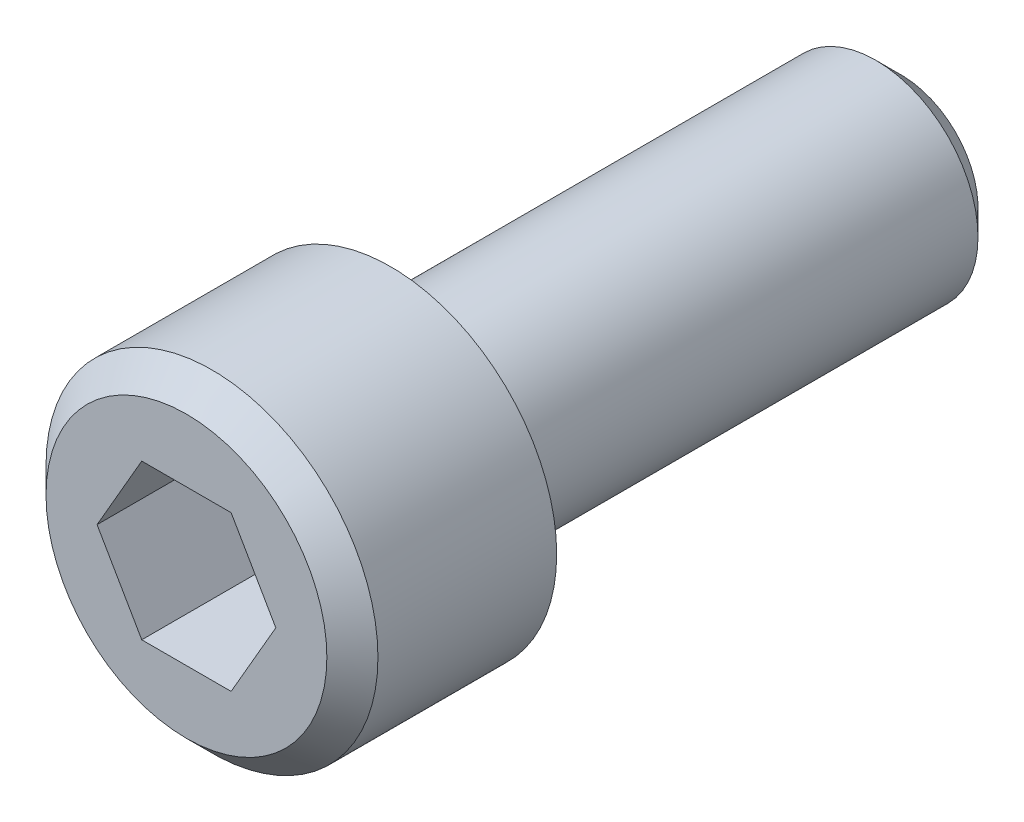
ISO-10303-21;
HEADER;
FILE_DESCRIPTION(('STEP AP214'),'2;1');
FILE_NAME('part.step','',(''),(''),'','','');
FILE_SCHEMA(('AUTOMOTIVE_DESIGN { 1 0 10303 214 1 1 1 1 }'));
ENDSEC;
DATA;
#1=APPLICATION_CONTEXT('core data for automotive mechanical design processes');
#2=APPLICATION_PROTOCOL_DEFINITION('international standard','automotive_design',2000,#1);
#3=PRODUCT_CONTEXT('',#1,'mechanical');
#4=PRODUCT('Part','Part','',(#3));
#5=PRODUCT_RELATED_PRODUCT_CATEGORY('part','',(#4));
#6=PRODUCT_DEFINITION_FORMATION('','',#4);
#7=PRODUCT_DEFINITION_CONTEXT('part definition',#1,'design');
#8=PRODUCT_DEFINITION('design','',#6,#7);
#9=PRODUCT_DEFINITION_SHAPE('','',#8);
#10=(LENGTH_UNIT() NAMED_UNIT(*) SI_UNIT(.MILLI.,.METRE.));
#11=(NAMED_UNIT(*) PLANE_ANGLE_UNIT() SI_UNIT($,.RADIAN.));
#12=(NAMED_UNIT(*) SI_UNIT($,.STERADIAN.) SOLID_ANGLE_UNIT());
#13=UNCERTAINTY_MEASURE_WITH_UNIT(LENGTH_MEASURE(1.E-05),#10,'distance_accuracy_value','');
#14=(GEOMETRIC_REPRESENTATION_CONTEXT(3) GLOBAL_UNCERTAINTY_ASSIGNED_CONTEXT((#13)) GLOBAL_UNIT_ASSIGNED_CONTEXT((#10,
#11,#12)) REPRESENTATION_CONTEXT('',''));
#15=CARTESIAN_POINT('',(0.,0.,0.));
#16=DIRECTION('',(0.,0.,1.));
#17=DIRECTION('',(1.,0.,0.));
#18=AXIS2_PLACEMENT_3D('',#15,#16,#17);
#19=CARTESIAN_POINT('',(0.,0.,0.));
#20=DIRECTION('',(0.,0.,1.));
#21=DIRECTION('',(1.,0.,0.));
#22=AXIS2_PLACEMENT_3D('',#19,#20,#21);
#23=PLANE('',#22);
#24=CARTESIAN_POINT('',(0.,0.,0.));
#25=DIRECTION('',(0.,0.,1.));
#26=DIRECTION('',(1.,0.,0.));
#27=AXIS2_PLACEMENT_3D('',#24,#25,#26);
#28=CIRCLE('',#27,6.5);
#29=CARTESIAN_POINT('',(6.5,0.,0.));
#30=VERTEX_POINT('',#29);
#31=EDGE_CURVE('E135',#30,#30,#28,.T.);
#32=ORIENTED_EDGE('',*,*,#31,.F.);
#33=EDGE_LOOP('',(#32));
#34=FACE_BOUND('',#33,.T.);
#35=CARTESIAN_POINT('',(0.,0.,0.));
#36=DIRECTION('',(0.,0.,1.));
#37=DIRECTION('',(1.,0.,0.));
#38=AXIS2_PLACEMENT_3D('',#35,#36,#37);
#39=CIRCLE('',#38,4.);
#40=CARTESIAN_POINT('',(4.,0.,0.));
#41=VERTEX_POINT('',#40);
#42=EDGE_CURVE('E143',#41,#41,#39,.F.);
#43=ORIENTED_EDGE('',*,*,#42,.F.);
#44=EDGE_LOOP('',(#43));
#45=FACE_BOUND('',#44,.T.);
#46=ADVANCED_FACE('F33',(#34,#45),#23,.F.);
#47=CARTESIAN_POINT('',(0.,0.,8.));
#48=DIRECTION('',(0.,0.,-1.));
#49=DIRECTION('',(-1.,0.,0.));
#50=AXIS2_PLACEMENT_3D('',#47,#48,#49);
#51=CYLINDRICAL_SURFACE('',#50,6.5);
#52=CARTESIAN_POINT('',(0.,0.,6.99999999999999));
#53=DIRECTION('',(0.,0.,1.));
#54=DIRECTION('',(1.,0.,0.));
#55=AXIS2_PLACEMENT_3D('',#52,#53,#54);
#56=CIRCLE('',#55,6.5);
#57=CARTESIAN_POINT('',(6.5,0.,6.99999999999999));
#58=VERTEX_POINT('',#57);
#59=EDGE_CURVE('E149',#58,#58,#56,.F.);
#60=ORIENTED_EDGE('',*,*,#59,.T.);
#61=EDGE_LOOP('',(#60));
#62=FACE_BOUND('',#61,.T.);
#63=ORIENTED_EDGE('',*,*,#31,.T.);
#64=EDGE_LOOP('',(#63));
#65=FACE_BOUND('',#64,.T.);
#66=ADVANCED_FACE('F169',(#62,#65),#51,.T.);
#67=CARTESIAN_POINT('',(0.,0.,8.));
#68=DIRECTION('',(0.,0.,1.));
#69=DIRECTION('',(1.,0.,0.));
#70=AXIS2_PLACEMENT_3D('',#67,#68,#69);
#71=PLANE('',#70);
#72=DIRECTION('',(0.5,0.866025403784439,0.));
#73=VECTOR('',#72,1.);
#74=CARTESIAN_POINT('',(1.75,-3.03108891324554,8.));
#75=LINE('',#74,#73);
#76=CARTESIAN_POINT('',(1.75,-3.03108891324554,8.));
#77=VERTEX_POINT('',#76);
#78=CARTESIAN_POINT('',(3.5,0.,8.));
#79=VERTEX_POINT('',#78);
#80=EDGE_CURVE('E48',#77,#79,#75,.T.);
#81=ORIENTED_EDGE('',*,*,#80,.F.);
#82=DIRECTION('',(1.,0.,0.));
#83=VECTOR('',#82,1.);
#84=CARTESIAN_POINT('',(-1.75,-3.03108891324554,8.));
#85=LINE('',#84,#83);
#86=CARTESIAN_POINT('',(-1.75,-3.03108891324554,8.));
#87=VERTEX_POINT('',#86);
#88=EDGE_CURVE('E131',#87,#77,#85,.T.);
#89=ORIENTED_EDGE('',*,*,#88,.F.);
#90=DIRECTION('',(0.5,-0.866025403784439,0.));
#91=VECTOR('',#90,1.);
#92=CARTESIAN_POINT('',(-3.5,0.,8.));
#93=LINE('',#92,#91);
#94=CARTESIAN_POINT('',(-3.5,0.,8.));
#95=VERTEX_POINT('',#94);
#96=EDGE_CURVE('E129',#95,#87,#93,.T.);
#97=ORIENTED_EDGE('',*,*,#96,.F.);
#98=DIRECTION('',(-0.5,-0.866025403784439,0.));
#99=VECTOR('',#98,1.);
#100=CARTESIAN_POINT('',(-1.75,3.03108891324554,8.));
#101=LINE('',#100,#99);
#102=CARTESIAN_POINT('',(-1.75,3.03108891324554,8.));
#103=VERTEX_POINT('',#102);
#104=EDGE_CURVE('E96',#103,#95,#101,.T.);
#105=ORIENTED_EDGE('',*,*,#104,.F.);
#106=DIRECTION('',(-1.,0.,0.));
#107=VECTOR('',#106,1.);
#108=CARTESIAN_POINT('',(1.75,3.03108891324554,8.));
#109=LINE('',#108,#107);
#110=CARTESIAN_POINT('',(1.75,3.03108891324554,8.));
#111=VERTEX_POINT('',#110);
#112=EDGE_CURVE('E125',#111,#103,#109,.T.);
#113=ORIENTED_EDGE('',*,*,#112,.F.);
#114=DIRECTION('',(-0.5,0.866025403784438,0.));
#115=VECTOR('',#114,1.);
#116=CARTESIAN_POINT('',(3.5,0.,8.));
#117=LINE('',#116,#115);
#118=EDGE_CURVE('E122',#79,#111,#117,.T.);
#119=ORIENTED_EDGE('',*,*,#118,.F.);
#120=EDGE_LOOP('',(#81,#89,#97,#105,#113,#119));
#121=FACE_BOUND('',#120,.T.);
#122=CARTESIAN_POINT('',(0.,0.,8.));
#123=DIRECTION('',(0.,0.,1.));
#124=DIRECTION('',(1.,0.,0.));
#125=AXIS2_PLACEMENT_3D('',#122,#123,#124);
#126=CIRCLE('',#125,5.49999999999999);
#127=CARTESIAN_POINT('',(5.49999999999999,0.,8.));
#128=VERTEX_POINT('',#127);
#129=EDGE_CURVE('E146',#128,#128,#126,.T.);
#130=ORIENTED_EDGE('',*,*,#129,.T.);
#131=EDGE_LOOP('',(#130));
#132=FACE_BOUND('',#131,.T.);
#133=ADVANCED_FACE('F175',(#121,#132),#71,.T.);
#134=CARTESIAN_POINT('',(0.,0.,-20.));
#135=DIRECTION('',(0.,0.,1.));
#136=DIRECTION('',(1.,0.,0.));
#137=AXIS2_PLACEMENT_3D('',#134,#135,#136);
#138=CYLINDRICAL_SURFACE('',#137,4.);
#139=CARTESIAN_POINT('',(0.,0.,-19.));
#140=DIRECTION('',(0.,0.,-1.));
#141=DIRECTION('',(-1.,0.,0.));
#142=AXIS2_PLACEMENT_3D('',#139,#140,#141);
#143=CIRCLE('',#142,4.);
#144=CARTESIAN_POINT('',(-4.,0.,-19.));
#145=VERTEX_POINT('',#144);
#146=EDGE_CURVE('E11',#145,#145,#143,.F.);
#147=ORIENTED_EDGE('',*,*,#146,.T.);
#148=EDGE_LOOP('',(#147));
#149=FACE_BOUND('',#148,.T.);
#150=ORIENTED_EDGE('',*,*,#42,.T.);
#151=EDGE_LOOP('',(#150));
#152=FACE_BOUND('',#151,.T.);
#153=ADVANCED_FACE('F183',(#149,#152),#138,.T.);
#154=CARTESIAN_POINT('',(0.,0.,-20.));
#155=DIRECTION('',(0.,0.,-1.));
#156=DIRECTION('',(-1.,0.,0.));
#157=AXIS2_PLACEMENT_3D('',#154,#155,#156);
#158=PLANE('',#157);
#159=CARTESIAN_POINT('',(0.,0.,-20.));
#160=DIRECTION('',(0.,0.,-1.));
#161=DIRECTION('',(-1.,0.,0.));
#162=AXIS2_PLACEMENT_3D('',#159,#160,#161);
#163=CIRCLE('',#162,3.);
#164=CARTESIAN_POINT('',(-3.,0.,-20.));
#165=VERTEX_POINT('',#164);
#166=EDGE_CURVE('E41',#165,#165,#163,.T.);
#167=ORIENTED_EDGE('',*,*,#166,.T.);
#168=EDGE_LOOP('',(#167));
#169=FACE_BOUND('',#168,.T.);
#170=ADVANCED_FACE('F154',(#169),#158,.T.);
#171=CARTESIAN_POINT('',(0.,0.,8.));
#172=DIRECTION('',(0.,0.,-1.));
#173=DIRECTION('',(-1.,0.,0.));
#174=AXIS2_PLACEMENT_3D('',#171,#172,#173);
#175=CONICAL_SURFACE('',#174,5.49999999999999,0.785398163397446);
#176=ORIENTED_EDGE('',*,*,#59,.F.);
#177=EDGE_LOOP('',(#176));
#178=FACE_BOUND('',#177,.T.);
#179=ORIENTED_EDGE('',*,*,#129,.F.);
#180=EDGE_LOOP('',(#179));
#181=FACE_BOUND('',#180,.T.);
#182=ADVANCED_FACE('F158',(#178,#181),#175,.T.);
#183=CARTESIAN_POINT('',(0.,0.,-20.));
#184=DIRECTION('',(0.,0.,1.));
#185=DIRECTION('',(1.,0.,0.));
#186=AXIS2_PLACEMENT_3D('',#183,#184,#185);
#187=CONICAL_SURFACE('',#186,3.,0.785398163397447);
#188=ORIENTED_EDGE('',*,*,#146,.F.);
#189=EDGE_LOOP('',(#188));
#190=FACE_BOUND('',#189,.T.);
#191=ORIENTED_EDGE('',*,*,#166,.F.);
#192=EDGE_LOOP('',(#191));
#193=FACE_BOUND('',#192,.T.);
#194=ADVANCED_FACE('F35',(#190,#193),#187,.T.);
#195=CARTESIAN_POINT('',(1.75,-3.03108891324554,2.));
#196=DIRECTION('',(0.866025403784439,-0.5,0.));
#197=DIRECTION('',(0.5,0.866025403784439,0.));
#198=AXIS2_PLACEMENT_3D('',#195,#196,#197);
#199=PLANE('',#198);
#200=ORIENTED_EDGE('',*,*,#80,.T.);
#201=DIRECTION('',(0.,0.,1.));
#202=VECTOR('',#201,1.);
#203=CARTESIAN_POINT('',(3.5,0.,2.));
#204=LINE('',#203,#202);
#205=CARTESIAN_POINT('',(3.5,0.,2.));
#206=VERTEX_POINT('',#205);
#207=EDGE_CURVE('E78',#206,#79,#204,.T.);
#208=ORIENTED_EDGE('',*,*,#207,.F.);
#209=DIRECTION('',(0.5,0.866025403784439,0.));
#210=VECTOR('',#209,1.);
#211=CARTESIAN_POINT('',(1.75,-3.03108891324554,2.));
#212=LINE('',#211,#210);
#213=CARTESIAN_POINT('',(1.75,-3.03108891324554,2.));
#214=VERTEX_POINT('',#213);
#215=EDGE_CURVE('E133',#214,#206,#212,.T.);
#216=ORIENTED_EDGE('',*,*,#215,.F.);
#217=DIRECTION('',(0.,0.,1.));
#218=VECTOR('',#217,1.);
#219=CARTESIAN_POINT('',(1.75,-3.03108891324554,2.));
#220=LINE('',#219,#218);
#221=EDGE_CURVE('E56',#214,#77,#220,.T.);
#222=ORIENTED_EDGE('',*,*,#221,.T.);
#223=EDGE_LOOP('',(#200,#208,#216,#222));
#224=FACE_BOUND('',#223,.T.);
#225=ADVANCED_FACE('F157',(#224),#199,.F.);
#226=CARTESIAN_POINT('',(-1.75,-3.03108891324554,2.));
#227=DIRECTION('',(0.,-1.,0.));
#228=DIRECTION('',(0.,0.,-1.));
#229=AXIS2_PLACEMENT_3D('',#226,#227,#228);
#230=PLANE('',#229);
#231=ORIENTED_EDGE('',*,*,#88,.T.);
#232=ORIENTED_EDGE('',*,*,#221,.F.);
#233=DIRECTION('',(1.,0.,0.));
#234=VECTOR('',#233,1.);
#235=CARTESIAN_POINT('',(-1.75,-3.03108891324554,2.));
#236=LINE('',#235,#234);
#237=CARTESIAN_POINT('',(-1.75,-3.03108891324554,2.));
#238=VERTEX_POINT('',#237);
#239=EDGE_CURVE('E108',#238,#214,#236,.T.);
#240=ORIENTED_EDGE('',*,*,#239,.F.);
#241=DIRECTION('',(0.,0.,1.));
#242=VECTOR('',#241,1.);
#243=CARTESIAN_POINT('',(-1.75,-3.03108891324554,2.));
#244=LINE('',#243,#242);
#245=EDGE_CURVE('E100',#238,#87,#244,.T.);
#246=ORIENTED_EDGE('',*,*,#245,.T.);
#247=EDGE_LOOP('',(#231,#232,#240,#246));
#248=FACE_BOUND('',#247,.T.);
#249=ADVANCED_FACE('F164',(#248),#230,.F.);
#250=CARTESIAN_POINT('',(-3.5,0.,2.));
#251=DIRECTION('',(-0.866025403784439,-0.5,0.));
#252=DIRECTION('',(0.5,-0.866025403784439,0.));
#253=AXIS2_PLACEMENT_3D('',#250,#251,#252);
#254=PLANE('',#253);
#255=ORIENTED_EDGE('',*,*,#96,.T.);
#256=ORIENTED_EDGE('',*,*,#245,.F.);
#257=DIRECTION('',(0.5,-0.866025403784439,0.));
#258=VECTOR('',#257,1.);
#259=CARTESIAN_POINT('',(-3.5,0.,2.));
#260=LINE('',#259,#258);
#261=CARTESIAN_POINT('',(-3.5,0.,2.));
#262=VERTEX_POINT('',#261);
#263=EDGE_CURVE('E104',#262,#238,#260,.T.);
#264=ORIENTED_EDGE('',*,*,#263,.F.);
#265=DIRECTION('',(0.,0.,1.));
#266=VECTOR('',#265,1.);
#267=CARTESIAN_POINT('',(-3.5,0.,2.));
#268=LINE('',#267,#266);
#269=EDGE_CURVE('E89',#262,#95,#268,.T.);
#270=ORIENTED_EDGE('',*,*,#269,.T.);
#271=EDGE_LOOP('',(#255,#256,#264,#270));
#272=FACE_BOUND('',#271,.T.);
#273=ADVANCED_FACE('F105',(#272),#254,.F.);
#274=CARTESIAN_POINT('',(-1.75,3.03108891324554,2.));
#275=DIRECTION('',(-0.866025403784439,0.5,0.));
#276=DIRECTION('',(-0.5,-0.866025403784439,0.));
#277=AXIS2_PLACEMENT_3D('',#274,#275,#276);
#278=PLANE('',#277);
#279=ORIENTED_EDGE('',*,*,#104,.T.);
#280=ORIENTED_EDGE('',*,*,#269,.F.);
#281=DIRECTION('',(-0.5,-0.866025403784439,0.));
#282=VECTOR('',#281,1.);
#283=CARTESIAN_POINT('',(-1.75,3.03108891324554,2.));
#284=LINE('',#283,#282);
#285=CARTESIAN_POINT('',(-1.75,3.03108891324554,2.));
#286=VERTEX_POINT('',#285);
#287=EDGE_CURVE('E93',#286,#262,#284,.T.);
#288=ORIENTED_EDGE('',*,*,#287,.F.);
#289=DIRECTION('',(0.,0.,1.));
#290=VECTOR('',#289,1.);
#291=CARTESIAN_POINT('',(-1.75,3.03108891324554,2.));
#292=LINE('',#291,#290);
#293=EDGE_CURVE('E101',#286,#103,#292,.T.);
#294=ORIENTED_EDGE('',*,*,#293,.T.);
#295=EDGE_LOOP('',(#279,#280,#288,#294));
#296=FACE_BOUND('',#295,.T.);
#297=ADVANCED_FACE('F91',(#296),#278,.F.);
#298=CARTESIAN_POINT('',(1.75,3.03108891324554,2.));
#299=DIRECTION('',(0.,1.,0.));
#300=DIRECTION('',(0.,0.,1.));
#301=AXIS2_PLACEMENT_3D('',#298,#299,#300);
#302=PLANE('',#301);
#303=ORIENTED_EDGE('',*,*,#112,.T.);
#304=ORIENTED_EDGE('',*,*,#293,.F.);
#305=DIRECTION('',(-1.,0.,0.));
#306=VECTOR('',#305,1.);
#307=CARTESIAN_POINT('',(1.75,3.03108891324554,2.));
#308=LINE('',#307,#306);
#309=CARTESIAN_POINT('',(1.75,3.03108891324554,2.));
#310=VERTEX_POINT('',#309);
#311=EDGE_CURVE('E114',#310,#286,#308,.T.);
#312=ORIENTED_EDGE('',*,*,#311,.F.);
#313=DIRECTION('',(0.,0.,1.));
#314=VECTOR('',#313,1.);
#315=CARTESIAN_POINT('',(1.75,3.03108891324554,2.));
#316=LINE('',#315,#314);
#317=EDGE_CURVE('E138',#310,#111,#316,.T.);
#318=ORIENTED_EDGE('',*,*,#317,.T.);
#319=EDGE_LOOP('',(#303,#304,#312,#318));
#320=FACE_BOUND('',#319,.T.);
#321=ADVANCED_FACE('F193',(#320),#302,.F.);
#322=CARTESIAN_POINT('',(3.5,0.,2.));
#323=DIRECTION('',(0.866025403784438,0.5,0.));
#324=DIRECTION('',(-0.5,0.866025403784439,0.));
#325=AXIS2_PLACEMENT_3D('',#322,#323,#324);
#326=PLANE('',#325);
#327=ORIENTED_EDGE('',*,*,#118,.T.);
#328=ORIENTED_EDGE('',*,*,#317,.F.);
#329=DIRECTION('',(-0.5,0.866025403784438,0.));
#330=VECTOR('',#329,1.);
#331=CARTESIAN_POINT('',(3.5,0.,2.));
#332=LINE('',#331,#330);
#333=EDGE_CURVE('E116',#206,#310,#332,.T.);
#334=ORIENTED_EDGE('',*,*,#333,.F.);
#335=ORIENTED_EDGE('',*,*,#207,.T.);
#336=EDGE_LOOP('',(#327,#328,#334,#335));
#337=FACE_BOUND('',#336,.T.);
#338=ADVANCED_FACE('F190',(#337),#326,.F.);
#339=CARTESIAN_POINT('',(0.,0.,2.));
#340=DIRECTION('',(0.,0.,1.));
#341=DIRECTION('',(1.,0.,0.));
#342=AXIS2_PLACEMENT_3D('',#339,#340,#341);
#343=PLANE('',#342);
#344=ORIENTED_EDGE('',*,*,#215,.T.);
#345=ORIENTED_EDGE('',*,*,#333,.T.);
#346=ORIENTED_EDGE('',*,*,#311,.T.);
#347=ORIENTED_EDGE('',*,*,#287,.T.);
#348=ORIENTED_EDGE('',*,*,#263,.T.);
#349=ORIENTED_EDGE('',*,*,#239,.T.);
#350=EDGE_LOOP('',(#344,#345,#346,#347,#348,#349));
#351=FACE_BOUND('',#350,.T.);
#352=ADVANCED_FACE('F111',(#351),#343,.T.);
#353=CLOSED_SHELL('',(#46,#66,#133,#153,#170,#182,#194,#225,#249,#273,#297,#321,#338,#352));
#354=MANIFOLD_SOLID_BREP('B2',#353);
#355=ADVANCED_BREP_SHAPE_REPRESENTATION('',(#18,#354),#14);
#356=SHAPE_DEFINITION_REPRESENTATION(#9,#355);
ENDSEC;
END-ISO-10303-21;
